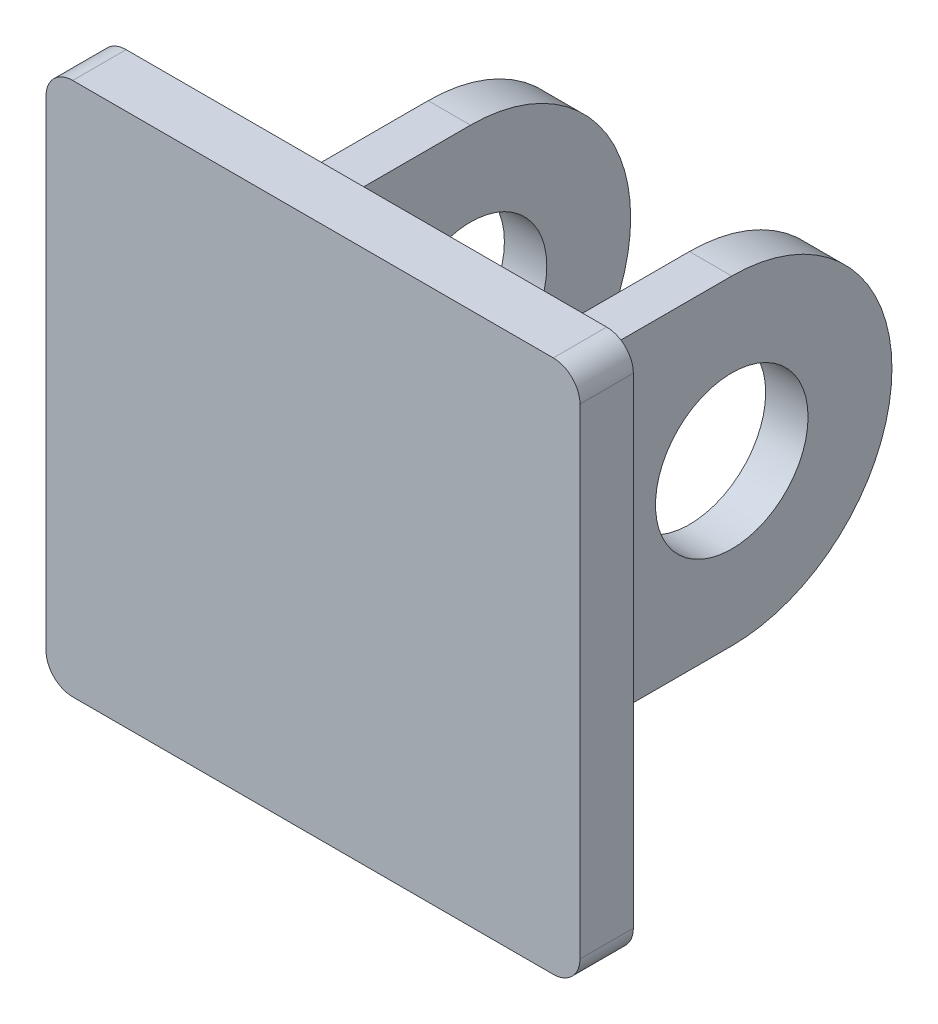
ISO-10303-21;
HEADER;
FILE_DESCRIPTION(('STEP AP214'),'2;1');
FILE_NAME('part.step','',(''),(''),'','','');
FILE_SCHEMA(('AUTOMOTIVE_DESIGN { 1 0 10303 214 1 1 1 1 }'));
ENDSEC;
DATA;
#1=APPLICATION_CONTEXT('core data for automotive mechanical design processes');
#2=APPLICATION_PROTOCOL_DEFINITION('international standard','automotive_design',2000,#1);
#3=PRODUCT_CONTEXT('',#1,'mechanical');
#4=PRODUCT('Part','Part','',(#3));
#5=PRODUCT_RELATED_PRODUCT_CATEGORY('part','',(#4));
#6=PRODUCT_DEFINITION_FORMATION('','',#4);
#7=PRODUCT_DEFINITION_CONTEXT('part definition',#1,'design');
#8=PRODUCT_DEFINITION('design','',#6,#7);
#9=PRODUCT_DEFINITION_SHAPE('','',#8);
#10=(LENGTH_UNIT() NAMED_UNIT(*) SI_UNIT(.MILLI.,.METRE.));
#11=(NAMED_UNIT(*) PLANE_ANGLE_UNIT() SI_UNIT($,.RADIAN.));
#12=(NAMED_UNIT(*) SI_UNIT($,.STERADIAN.) SOLID_ANGLE_UNIT());
#13=UNCERTAINTY_MEASURE_WITH_UNIT(LENGTH_MEASURE(1.E-05),#10,'distance_accuracy_value','');
#14=(GEOMETRIC_REPRESENTATION_CONTEXT(3) GLOBAL_UNCERTAINTY_ASSIGNED_CONTEXT((#13)) GLOBAL_UNIT_ASSIGNED_CONTEXT((#10,
#11,#12)) REPRESENTATION_CONTEXT('',''));
#15=CARTESIAN_POINT('',(0.,0.,0.));
#16=DIRECTION('',(0.,0.,1.));
#17=DIRECTION('',(1.,0.,0.));
#18=AXIS2_PLACEMENT_3D('',#15,#16,#17);
#19=CARTESIAN_POINT('',(0.,0.,0.));
#20=DIRECTION('',(0.,0.,-1.));
#21=DIRECTION('',(-1.,0.,0.));
#22=AXIS2_PLACEMENT_3D('',#19,#20,#21);
#23=PLANE('',#22);
#24=DIRECTION('',(1.,0.,0.));
#25=VECTOR('',#24,1.);
#26=CARTESIAN_POINT('',(50.,-50.,0.));
#27=LINE('',#26,#25);
#28=CARTESIAN_POINT('',(-45.,-50.,0.));
#29=VERTEX_POINT('',#28);
#30=CARTESIAN_POINT('',(45.,-50.,0.));
#31=VERTEX_POINT('',#30);
#32=EDGE_CURVE('E249',#29,#31,#27,.T.);
#33=ORIENTED_EDGE('',*,*,#32,.F.);
#34=CARTESIAN_POINT('',(-45.,-45.,0.));
#35=DIRECTION('',(0.,0.,-1.));
#36=DIRECTION('',(-1.,0.,0.));
#37=AXIS2_PLACEMENT_3D('',#34,#35,#36);
#38=CIRCLE('',#37,5.);
#39=CARTESIAN_POINT('',(-50.,-45.,0.));
#40=VERTEX_POINT('',#39);
#41=EDGE_CURVE('E266',#29,#40,#38,.T.);
#42=ORIENTED_EDGE('',*,*,#41,.T.);
#43=DIRECTION('',(0.,-1.,0.));
#44=VECTOR('',#43,1.);
#45=CARTESIAN_POINT('',(-50.,50.,0.));
#46=LINE('',#45,#44);
#47=CARTESIAN_POINT('',(-50.,45.,0.));
#48=VERTEX_POINT('',#47);
#49=EDGE_CURVE('E234',#48,#40,#46,.T.);
#50=ORIENTED_EDGE('',*,*,#49,.F.);
#51=CARTESIAN_POINT('',(-45.,45.,0.));
#52=DIRECTION('',(0.,0.,-1.));
#53=DIRECTION('',(-1.,0.,0.));
#54=AXIS2_PLACEMENT_3D('',#51,#52,#53);
#55=CIRCLE('',#54,5.);
#56=CARTESIAN_POINT('',(-45.,50.,0.));
#57=VERTEX_POINT('',#56);
#58=EDGE_CURVE('E264',#48,#57,#55,.T.);
#59=ORIENTED_EDGE('',*,*,#58,.T.);
#60=DIRECTION('',(-1.,0.,0.));
#61=VECTOR('',#60,1.);
#62=CARTESIAN_POINT('',(50.,50.,0.));
#63=LINE('',#62,#61);
#64=CARTESIAN_POINT('',(45.,50.,0.));
#65=VERTEX_POINT('',#64);
#66=EDGE_CURVE('E239',#65,#57,#63,.T.);
#67=ORIENTED_EDGE('',*,*,#66,.F.);
#68=CARTESIAN_POINT('',(45.,45.,0.));
#69=DIRECTION('',(0.,0.,-1.));
#70=DIRECTION('',(-1.,0.,0.));
#71=AXIS2_PLACEMENT_3D('',#68,#69,#70);
#72=CIRCLE('',#71,5.);
#73=CARTESIAN_POINT('',(50.,45.,0.));
#74=VERTEX_POINT('',#73);
#75=EDGE_CURVE('E260',#65,#74,#72,.T.);
#76=ORIENTED_EDGE('',*,*,#75,.T.);
#77=DIRECTION('',(0.,1.,0.));
#78=VECTOR('',#77,1.);
#79=CARTESIAN_POINT('',(50.,50.,0.));
#80=LINE('',#79,#78);
#81=CARTESIAN_POINT('',(50.,-45.,0.));
#82=VERTEX_POINT('',#81);
#83=EDGE_CURVE('E252',#82,#74,#80,.T.);
#84=ORIENTED_EDGE('',*,*,#83,.F.);
#85=CARTESIAN_POINT('',(45.,-45.,0.));
#86=DIRECTION('',(0.,0.,-1.));
#87=DIRECTION('',(-1.,0.,0.));
#88=AXIS2_PLACEMENT_3D('',#85,#86,#87);
#89=CIRCLE('',#88,5.);
#90=EDGE_CURVE('E262',#82,#31,#89,.T.);
#91=ORIENTED_EDGE('',*,*,#90,.T.);
#92=EDGE_LOOP('',(#33,#42,#50,#59,#67,#76,#84,#91));
#93=FACE_BOUND('',#92,.T.);
#94=DIRECTION('',(0.,-1.,0.));
#95=VECTOR('',#94,1.);
#96=CARTESIAN_POINT('',(20.5,30.,0.));
#97=LINE('',#96,#95);
#98=CARTESIAN_POINT('',(20.5,30.,0.));
#99=VERTEX_POINT('',#98);
#100=CARTESIAN_POINT('',(20.5,-30.,0.));
#101=VERTEX_POINT('',#100);
#102=EDGE_CURVE('E201',#99,#101,#97,.T.);
#103=ORIENTED_EDGE('',*,*,#102,.T.);
#104=DIRECTION('',(-1.,0.,0.));
#105=VECTOR('',#104,1.);
#106=CARTESIAN_POINT('',(28.4375,-30.,0.));
#107=LINE('',#106,#105);
#108=CARTESIAN_POINT('',(28.4375,-30.,0.));
#109=VERTEX_POINT('',#108);
#110=EDGE_CURVE('E231',#109,#101,#107,.T.);
#111=ORIENTED_EDGE('',*,*,#110,.F.);
#112=DIRECTION('',(0.,-1.,0.));
#113=VECTOR('',#112,1.);
#114=CARTESIAN_POINT('',(28.4375,30.,0.));
#115=LINE('',#114,#113);
#116=CARTESIAN_POINT('',(28.4375,30.,0.));
#117=VERTEX_POINT('',#116);
#118=EDGE_CURVE('E204',#117,#109,#115,.T.);
#119=ORIENTED_EDGE('',*,*,#118,.F.);
#120=DIRECTION('',(-1.,0.,0.));
#121=VECTOR('',#120,1.);
#122=CARTESIAN_POINT('',(28.4375,30.,0.));
#123=LINE('',#122,#121);
#124=EDGE_CURVE('E214',#117,#99,#123,.T.);
#125=ORIENTED_EDGE('',*,*,#124,.T.);
#126=EDGE_LOOP('',(#103,#111,#119,#125));
#127=FACE_BOUND('',#126,.T.);
#128=DIRECTION('',(1.,0.,0.));
#129=VECTOR('',#128,1.);
#130=CARTESIAN_POINT('',(-28.4375,30.,0.));
#131=LINE('',#130,#129);
#132=CARTESIAN_POINT('',(-28.4375,30.,0.));
#133=VERTEX_POINT('',#132);
#134=CARTESIAN_POINT('',(-20.5,30.,0.));
#135=VERTEX_POINT('',#134);
#136=EDGE_CURVE('E165',#133,#135,#131,.T.);
#137=ORIENTED_EDGE('',*,*,#136,.F.);
#138=DIRECTION('',(0.,-1.,0.));
#139=VECTOR('',#138,1.);
#140=CARTESIAN_POINT('',(-28.4375,30.,0.));
#141=LINE('',#140,#139);
#142=CARTESIAN_POINT('',(-28.4375,-30.,0.));
#143=VERTEX_POINT('',#142);
#144=EDGE_CURVE('E175',#133,#143,#141,.T.);
#145=ORIENTED_EDGE('',*,*,#144,.T.);
#146=DIRECTION('',(1.,0.,0.));
#147=VECTOR('',#146,1.);
#148=CARTESIAN_POINT('',(-28.4375,-30.,0.));
#149=LINE('',#148,#147);
#150=CARTESIAN_POINT('',(-20.5,-30.,0.));
#151=VERTEX_POINT('',#150);
#152=EDGE_CURVE('E180',#143,#151,#149,.T.);
#153=ORIENTED_EDGE('',*,*,#152,.T.);
#154=DIRECTION('',(0.,-1.,0.));
#155=VECTOR('',#154,1.);
#156=CARTESIAN_POINT('',(-20.5,30.,0.));
#157=LINE('',#156,#155);
#158=EDGE_CURVE('E184',#135,#151,#157,.T.);
#159=ORIENTED_EDGE('',*,*,#158,.F.);
#160=EDGE_LOOP('',(#137,#145,#153,#159));
#161=FACE_BOUND('',#160,.T.);
#162=ADVANCED_FACE('F39',(#93,#127,#161),#23,.T.);
#163=CARTESIAN_POINT('',(-50.,50.,10.));
#164=DIRECTION('',(1.,0.,0.));
#165=DIRECTION('',(0.,1.,0.));
#166=AXIS2_PLACEMENT_3D('',#163,#164,#165);
#167=PLANE('',#166);
#168=ORIENTED_EDGE('',*,*,#49,.T.);
#169=DIRECTION('',(0.,0.,-1.));
#170=VECTOR('',#169,1.);
#171=CARTESIAN_POINT('',(-50.,-45.,10.));
#172=LINE('',#171,#170);
#173=CARTESIAN_POINT('',(-50.,-45.,10.));
#174=VERTEX_POINT('',#173);
#175=EDGE_CURVE('E271',#40,#174,#172,.F.);
#176=ORIENTED_EDGE('',*,*,#175,.T.);
#177=DIRECTION('',(0.,-1.,0.));
#178=VECTOR('',#177,1.);
#179=CARTESIAN_POINT('',(-50.,50.,10.));
#180=LINE('',#179,#178);
#181=CARTESIAN_POINT('',(-50.,45.,10.));
#182=VERTEX_POINT('',#181);
#183=EDGE_CURVE('E235',#182,#174,#180,.T.);
#184=ORIENTED_EDGE('',*,*,#183,.F.);
#185=DIRECTION('',(0.,0.,-1.));
#186=VECTOR('',#185,1.);
#187=CARTESIAN_POINT('',(-50.,45.,10.));
#188=LINE('',#187,#186);
#189=EDGE_CURVE('E268',#182,#48,#188,.T.);
#190=ORIENTED_EDGE('',*,*,#189,.T.);
#191=EDGE_LOOP('',(#168,#176,#184,#190));
#192=FACE_BOUND('',#191,.T.);
#193=ADVANCED_FACE('F305',(#192),#167,.F.);
#194=CARTESIAN_POINT('',(50.,-50.,10.));
#195=DIRECTION('',(0.,1.,0.));
#196=DIRECTION('',(-1.,0.,0.));
#197=AXIS2_PLACEMENT_3D('',#194,#195,#196);
#198=PLANE('',#197);
#199=DIRECTION('',(1.,0.,0.));
#200=VECTOR('',#199,1.);
#201=CARTESIAN_POINT('',(50.,-50.,10.));
#202=LINE('',#201,#200);
#203=CARTESIAN_POINT('',(-45.,-50.,10.));
#204=VERTEX_POINT('',#203);
#205=CARTESIAN_POINT('',(45.,-50.,10.));
#206=VERTEX_POINT('',#205);
#207=EDGE_CURVE('E238',#204,#206,#202,.T.);
#208=ORIENTED_EDGE('',*,*,#207,.F.);
#209=DIRECTION('',(0.,0.,-1.));
#210=VECTOR('',#209,1.);
#211=CARTESIAN_POINT('',(-45.,-50.,10.));
#212=LINE('',#211,#210);
#213=EDGE_CURVE('E257',#204,#29,#212,.T.);
#214=ORIENTED_EDGE('',*,*,#213,.T.);
#215=ORIENTED_EDGE('',*,*,#32,.T.);
#216=DIRECTION('',(0.,0.,-1.));
#217=VECTOR('',#216,1.);
#218=CARTESIAN_POINT('',(45.,-50.,10.));
#219=LINE('',#218,#217);
#220=EDGE_CURVE('E246',#31,#206,#219,.F.);
#221=ORIENTED_EDGE('',*,*,#220,.T.);
#222=EDGE_LOOP('',(#208,#214,#215,#221));
#223=FACE_BOUND('',#222,.T.);
#224=ADVANCED_FACE('F313',(#223),#198,.F.);
#225=CARTESIAN_POINT('',(50.,50.,10.));
#226=DIRECTION('',(-1.,0.,0.));
#227=DIRECTION('',(0.,-1.,0.));
#228=AXIS2_PLACEMENT_3D('',#225,#226,#227);
#229=PLANE('',#228);
#230=DIRECTION('',(0.,1.,0.));
#231=VECTOR('',#230,1.);
#232=CARTESIAN_POINT('',(50.,50.,10.));
#233=LINE('',#232,#231);
#234=CARTESIAN_POINT('',(50.,-45.,10.));
#235=VERTEX_POINT('',#234);
#236=CARTESIAN_POINT('',(50.,45.,10.));
#237=VERTEX_POINT('',#236);
#238=EDGE_CURVE('E242',#235,#237,#233,.T.);
#239=ORIENTED_EDGE('',*,*,#238,.F.);
#240=DIRECTION('',(0.,0.,-1.));
#241=VECTOR('',#240,1.);
#242=CARTESIAN_POINT('',(50.,-45.,10.));
#243=LINE('',#242,#241);
#244=EDGE_CURVE('E11',#235,#82,#243,.T.);
#245=ORIENTED_EDGE('',*,*,#244,.T.);
#246=ORIENTED_EDGE('',*,*,#83,.T.);
#247=DIRECTION('',(0.,0.,-1.));
#248=VECTOR('',#247,1.);
#249=CARTESIAN_POINT('',(50.,45.,10.));
#250=LINE('',#249,#248);
#251=EDGE_CURVE('E47',#74,#237,#250,.F.);
#252=ORIENTED_EDGE('',*,*,#251,.T.);
#253=EDGE_LOOP('',(#239,#245,#246,#252));
#254=FACE_BOUND('',#253,.T.);
#255=ADVANCED_FACE('F286',(#254),#229,.F.);
#256=CARTESIAN_POINT('',(50.,50.,10.));
#257=DIRECTION('',(0.,-1.,0.));
#258=DIRECTION('',(1.,0.,0.));
#259=AXIS2_PLACEMENT_3D('',#256,#257,#258);
#260=PLANE('',#259);
#261=ORIENTED_EDGE('',*,*,#66,.T.);
#262=DIRECTION('',(0.,0.,-1.));
#263=VECTOR('',#262,1.);
#264=CARTESIAN_POINT('',(-45.,50.,10.));
#265=LINE('',#264,#263);
#266=CARTESIAN_POINT('',(-45.,50.,10.));
#267=VERTEX_POINT('',#266);
#268=EDGE_CURVE('E54',#57,#267,#265,.F.);
#269=ORIENTED_EDGE('',*,*,#268,.T.);
#270=DIRECTION('',(-1.,0.,0.));
#271=VECTOR('',#270,1.);
#272=CARTESIAN_POINT('',(50.,50.,10.));
#273=LINE('',#272,#271);
#274=CARTESIAN_POINT('',(45.,50.,10.));
#275=VERTEX_POINT('',#274);
#276=EDGE_CURVE('E244',#275,#267,#273,.T.);
#277=ORIENTED_EDGE('',*,*,#276,.F.);
#278=DIRECTION('',(0.,0.,-1.));
#279=VECTOR('',#278,1.);
#280=CARTESIAN_POINT('',(45.,50.,10.));
#281=LINE('',#280,#279);
#282=EDGE_CURVE('E280',#275,#65,#281,.T.);
#283=ORIENTED_EDGE('',*,*,#282,.T.);
#284=EDGE_LOOP('',(#261,#269,#277,#283));
#285=FACE_BOUND('',#284,.T.);
#286=ADVANCED_FACE('F294',(#285),#260,.F.);
#287=CARTESIAN_POINT('',(0.,0.,10.));
#288=DIRECTION('',(0.,0.,-1.));
#289=DIRECTION('',(-1.,0.,0.));
#290=AXIS2_PLACEMENT_3D('',#287,#288,#289);
#291=PLANE('',#290);
#292=ORIENTED_EDGE('',*,*,#183,.T.);
#293=CARTESIAN_POINT('',(-45.,-45.,10.));
#294=DIRECTION('',(0.,0.,-1.));
#295=DIRECTION('',(-1.,0.,0.));
#296=AXIS2_PLACEMENT_3D('',#293,#294,#295);
#297=CIRCLE('',#296,5.);
#298=EDGE_CURVE('E278',#174,#204,#297,.F.);
#299=ORIENTED_EDGE('',*,*,#298,.T.);
#300=ORIENTED_EDGE('',*,*,#207,.T.);
#301=CARTESIAN_POINT('',(45.,-45.,10.));
#302=DIRECTION('',(0.,0.,-1.));
#303=DIRECTION('',(-1.,0.,0.));
#304=AXIS2_PLACEMENT_3D('',#301,#302,#303);
#305=CIRCLE('',#304,5.);
#306=EDGE_CURVE('E274',#206,#235,#305,.F.);
#307=ORIENTED_EDGE('',*,*,#306,.T.);
#308=ORIENTED_EDGE('',*,*,#238,.T.);
#309=CARTESIAN_POINT('',(45.,45.,10.));
#310=DIRECTION('',(0.,0.,-1.));
#311=DIRECTION('',(-1.,0.,0.));
#312=AXIS2_PLACEMENT_3D('',#309,#310,#311);
#313=CIRCLE('',#312,5.);
#314=EDGE_CURVE('E61',#237,#275,#313,.F.);
#315=ORIENTED_EDGE('',*,*,#314,.T.);
#316=ORIENTED_EDGE('',*,*,#276,.T.);
#317=CARTESIAN_POINT('',(-45.,45.,10.));
#318=DIRECTION('',(0.,0.,-1.));
#319=DIRECTION('',(-1.,0.,0.));
#320=AXIS2_PLACEMENT_3D('',#317,#318,#319);
#321=CIRCLE('',#320,5.);
#322=EDGE_CURVE('E276',#267,#182,#321,.F.);
#323=ORIENTED_EDGE('',*,*,#322,.T.);
#324=EDGE_LOOP('',(#292,#299,#300,#307,#308,#315,#316,#323));
#325=FACE_BOUND('',#324,.T.);
#326=ADVANCED_FACE('F290',(#325),#291,.F.);
#327=CARTESIAN_POINT('',(28.4375,0.,-40.));
#328=DIRECTION('',(-1.,0.,0.));
#329=DIRECTION('',(0.,0.,1.));
#330=AXIS2_PLACEMENT_3D('',#327,#328,#329);
#331=PLANE('',#330);
#332=ORIENTED_EDGE('',*,*,#118,.T.);
#333=DIRECTION('',(0.,0.,-1.));
#334=VECTOR('',#333,1.);
#335=CARTESIAN_POINT('',(28.4375,-30.,0.));
#336=LINE('',#335,#334);
#337=CARTESIAN_POINT('',(28.4375,-30.,-40.));
#338=VERTEX_POINT('',#337);
#339=EDGE_CURVE('E207',#109,#338,#336,.T.);
#340=ORIENTED_EDGE('',*,*,#339,.T.);
#341=CARTESIAN_POINT('',(28.4375,0.,-40.));
#342=DIRECTION('',(1.,0.,0.));
#343=DIRECTION('',(0.,0.,1.));
#344=AXIS2_PLACEMENT_3D('',#341,#342,#343);
#345=CIRCLE('',#344,30.);
#346=CARTESIAN_POINT('',(28.4375,30.,-40.));
#347=VERTEX_POINT('',#346);
#348=EDGE_CURVE('E210',#338,#347,#345,.T.);
#349=ORIENTED_EDGE('',*,*,#348,.T.);
#350=DIRECTION('',(0.,0.,1.));
#351=VECTOR('',#350,1.);
#352=CARTESIAN_POINT('',(28.4375,30.,0.));
#353=LINE('',#352,#351);
#354=EDGE_CURVE('E212',#347,#117,#353,.T.);
#355=ORIENTED_EDGE('',*,*,#354,.T.);
#356=EDGE_LOOP('',(#332,#340,#349,#355));
#357=FACE_BOUND('',#356,.T.);
#358=CARTESIAN_POINT('',(28.4375,0.,-40.));
#359=DIRECTION('',(1.,0.,0.));
#360=DIRECTION('',(0.,0.,-1.));
#361=AXIS2_PLACEMENT_3D('',#358,#359,#360);
#362=CIRCLE('',#361,14.2875);
#363=CARTESIAN_POINT('',(28.4375,0.,-54.2875));
#364=VERTEX_POINT('',#363);
#365=EDGE_CURVE('E198',#364,#364,#362,.T.);
#366=ORIENTED_EDGE('',*,*,#365,.F.);
#367=EDGE_LOOP('',(#366));
#368=FACE_BOUND('',#367,.T.);
#369=ADVANCED_FACE('F370',(#357,#368),#331,.F.);
#370=CARTESIAN_POINT('',(20.5,0.,-40.));
#371=DIRECTION('',(-1.,0.,0.));
#372=DIRECTION('',(0.,0.,1.));
#373=AXIS2_PLACEMENT_3D('',#370,#371,#372);
#374=PLANE('',#373);
#375=ORIENTED_EDGE('',*,*,#102,.F.);
#376=DIRECTION('',(0.,0.,1.));
#377=VECTOR('',#376,1.);
#378=CARTESIAN_POINT('',(20.5,30.,0.));
#379=LINE('',#378,#377);
#380=CARTESIAN_POINT('',(20.5,30.,-40.));
#381=VERTEX_POINT('',#380);
#382=EDGE_CURVE('E208',#381,#99,#379,.T.);
#383=ORIENTED_EDGE('',*,*,#382,.F.);
#384=CARTESIAN_POINT('',(20.5,0.,-40.));
#385=DIRECTION('',(1.,0.,0.));
#386=DIRECTION('',(0.,0.,1.));
#387=AXIS2_PLACEMENT_3D('',#384,#385,#386);
#388=CIRCLE('',#387,30.);
#389=CARTESIAN_POINT('',(20.5,-30.,-40.));
#390=VERTEX_POINT('',#389);
#391=EDGE_CURVE('E219',#390,#381,#388,.T.);
#392=ORIENTED_EDGE('',*,*,#391,.F.);
#393=DIRECTION('',(0.,0.,-1.));
#394=VECTOR('',#393,1.);
#395=CARTESIAN_POINT('',(20.5,-30.,0.));
#396=LINE('',#395,#394);
#397=EDGE_CURVE('E217',#101,#390,#396,.T.);
#398=ORIENTED_EDGE('',*,*,#397,.F.);
#399=EDGE_LOOP('',(#375,#383,#392,#398));
#400=FACE_BOUND('',#399,.T.);
#401=CARTESIAN_POINT('',(20.5,0.,-40.));
#402=DIRECTION('',(1.,0.,0.));
#403=DIRECTION('',(0.,0.,-1.));
#404=AXIS2_PLACEMENT_3D('',#401,#402,#403);
#405=CIRCLE('',#404,14.2875);
#406=CARTESIAN_POINT('',(20.5,0.,-54.2875));
#407=VERTEX_POINT('',#406);
#408=EDGE_CURVE('E197',#407,#407,#405,.T.);
#409=ORIENTED_EDGE('',*,*,#408,.T.);
#410=EDGE_LOOP('',(#409));
#411=FACE_BOUND('',#410,.T.);
#412=ADVANCED_FACE('F373',(#400,#411),#374,.T.);
#413=CARTESIAN_POINT('',(28.4375,-30.,0.));
#414=DIRECTION('',(0.,1.,0.));
#415=DIRECTION('',(0.,0.,1.));
#416=AXIS2_PLACEMENT_3D('',#413,#414,#415);
#417=PLANE('',#416);
#418=ORIENTED_EDGE('',*,*,#397,.T.);
#419=DIRECTION('',(-1.,0.,0.));
#420=VECTOR('',#419,1.);
#421=CARTESIAN_POINT('',(28.4375,-30.,-40.));
#422=LINE('',#421,#420);
#423=EDGE_CURVE('E228',#338,#390,#422,.T.);
#424=ORIENTED_EDGE('',*,*,#423,.F.);
#425=ORIENTED_EDGE('',*,*,#339,.F.);
#426=ORIENTED_EDGE('',*,*,#110,.T.);
#427=EDGE_LOOP('',(#418,#424,#425,#426));
#428=FACE_BOUND('',#427,.T.);
#429=ADVANCED_FACE('F377',(#428),#417,.F.);
#430=CARTESIAN_POINT('',(28.4375,0.,-40.));
#431=DIRECTION('',(-1.,0.,0.));
#432=DIRECTION('',(0.,0.,1.));
#433=AXIS2_PLACEMENT_3D('',#430,#431,#432);
#434=CYLINDRICAL_SURFACE('',#433,30.);
#435=ORIENTED_EDGE('',*,*,#391,.T.);
#436=DIRECTION('',(-1.,0.,0.));
#437=VECTOR('',#436,1.);
#438=CARTESIAN_POINT('',(28.4375,30.,-40.));
#439=LINE('',#438,#437);
#440=EDGE_CURVE('E225',#347,#381,#439,.T.);
#441=ORIENTED_EDGE('',*,*,#440,.F.);
#442=ORIENTED_EDGE('',*,*,#348,.F.);
#443=ORIENTED_EDGE('',*,*,#423,.T.);
#444=EDGE_LOOP('',(#435,#441,#442,#443));
#445=FACE_BOUND('',#444,.T.);
#446=ADVANCED_FACE('F381',(#445),#434,.T.);
#447=CARTESIAN_POINT('',(28.4375,30.,0.));
#448=DIRECTION('',(0.,-1.,0.));
#449=DIRECTION('',(0.,0.,-1.));
#450=AXIS2_PLACEMENT_3D('',#447,#448,#449);
#451=PLANE('',#450);
#452=ORIENTED_EDGE('',*,*,#382,.T.);
#453=ORIENTED_EDGE('',*,*,#124,.F.);
#454=ORIENTED_EDGE('',*,*,#354,.F.);
#455=ORIENTED_EDGE('',*,*,#440,.T.);
#456=EDGE_LOOP('',(#452,#453,#454,#455));
#457=FACE_BOUND('',#456,.T.);
#458=ADVANCED_FACE('F368',(#457),#451,.F.);
#459=CARTESIAN_POINT('',(28.4375,0.,-40.));
#460=DIRECTION('',(-1.,0.,0.));
#461=DIRECTION('',(0.,0.,1.));
#462=AXIS2_PLACEMENT_3D('',#459,#460,#461);
#463=CYLINDRICAL_SURFACE('',#462,14.2875);
#464=ORIENTED_EDGE('',*,*,#365,.T.);
#465=EDGE_LOOP('',(#464));
#466=FACE_BOUND('',#465,.T.);
#467=ORIENTED_EDGE('',*,*,#408,.F.);
#468=EDGE_LOOP('',(#467));
#469=FACE_BOUND('',#468,.T.);
#470=ADVANCED_FACE('F365',(#466,#469),#463,.F.);
#471=CARTESIAN_POINT('',(-28.4375,30.,0.));
#472=DIRECTION('',(0.,1.,0.));
#473=DIRECTION('',(0.,0.,1.));
#474=AXIS2_PLACEMENT_3D('',#471,#472,#473);
#475=PLANE('',#474);
#476=DIRECTION('',(0.,0.,1.));
#477=VECTOR('',#476,1.);
#478=CARTESIAN_POINT('',(-20.5,30.,0.));
#479=LINE('',#478,#477);
#480=CARTESIAN_POINT('',(-20.5,30.,-40.));
#481=VERTEX_POINT('',#480);
#482=EDGE_CURVE('E160',#481,#135,#479,.T.);
#483=ORIENTED_EDGE('',*,*,#482,.F.);
#484=DIRECTION('',(1.,0.,0.));
#485=VECTOR('',#484,1.);
#486=CARTESIAN_POINT('',(-28.4375,30.,-40.));
#487=LINE('',#486,#485);
#488=CARTESIAN_POINT('',(-28.4375,30.,-40.));
#489=VERTEX_POINT('',#488);
#490=EDGE_CURVE('E154',#489,#481,#487,.T.);
#491=ORIENTED_EDGE('',*,*,#490,.F.);
#492=DIRECTION('',(0.,0.,1.));
#493=VECTOR('',#492,1.);
#494=CARTESIAN_POINT('',(-28.4375,30.,0.));
#495=LINE('',#494,#493);
#496=EDGE_CURVE('E158',#489,#133,#495,.T.);
#497=ORIENTED_EDGE('',*,*,#496,.T.);
#498=ORIENTED_EDGE('',*,*,#136,.T.);
#499=EDGE_LOOP('',(#483,#491,#497,#498));
#500=FACE_BOUND('',#499,.T.);
#501=ADVANCED_FACE('F156',(#500),#475,.T.);
#502=CARTESIAN_POINT('',(-28.4375,0.,-40.));
#503=DIRECTION('',(1.,0.,0.));
#504=DIRECTION('',(0.,0.,-1.));
#505=AXIS2_PLACEMENT_3D('',#502,#503,#504);
#506=CYLINDRICAL_SURFACE('',#505,30.);
#507=CARTESIAN_POINT('',(-20.5,0.,-40.));
#508=DIRECTION('',(1.,0.,0.));
#509=DIRECTION('',(0.,0.,1.));
#510=AXIS2_PLACEMENT_3D('',#507,#508,#509);
#511=CIRCLE('',#510,30.);
#512=CARTESIAN_POINT('',(-20.5,-30.,-40.));
#513=VERTEX_POINT('',#512);
#514=EDGE_CURVE('E189',#513,#481,#511,.T.);
#515=ORIENTED_EDGE('',*,*,#514,.F.);
#516=DIRECTION('',(1.,0.,0.));
#517=VECTOR('',#516,1.);
#518=CARTESIAN_POINT('',(-28.4375,-30.,-40.));
#519=LINE('',#518,#517);
#520=CARTESIAN_POINT('',(-28.4375,-30.,-40.));
#521=VERTEX_POINT('',#520);
#522=EDGE_CURVE('E166',#521,#513,#519,.T.);
#523=ORIENTED_EDGE('',*,*,#522,.F.);
#524=CARTESIAN_POINT('',(-28.4375,0.,-40.));
#525=DIRECTION('',(1.,0.,0.));
#526=DIRECTION('',(0.,0.,1.));
#527=AXIS2_PLACEMENT_3D('',#524,#525,#526);
#528=CIRCLE('',#527,30.);
#529=EDGE_CURVE('E173',#521,#489,#528,.T.);
#530=ORIENTED_EDGE('',*,*,#529,.T.);
#531=ORIENTED_EDGE('',*,*,#490,.T.);
#532=EDGE_LOOP('',(#515,#523,#530,#531));
#533=FACE_BOUND('',#532,.T.);
#534=ADVANCED_FACE('F177',(#533),#506,.T.);
#535=CARTESIAN_POINT('',(-28.4375,-30.,0.));
#536=DIRECTION('',(0.,-1.,0.));
#537=DIRECTION('',(0.,0.,-1.));
#538=AXIS2_PLACEMENT_3D('',#535,#536,#537);
#539=PLANE('',#538);
#540=DIRECTION('',(0.,0.,-1.));
#541=VECTOR('',#540,1.);
#542=CARTESIAN_POINT('',(-20.5,-30.,0.));
#543=LINE('',#542,#541);
#544=EDGE_CURVE('E191',#151,#513,#543,.T.);
#545=ORIENTED_EDGE('',*,*,#544,.F.);
#546=ORIENTED_EDGE('',*,*,#152,.F.);
#547=DIRECTION('',(0.,0.,-1.));
#548=VECTOR('',#547,1.);
#549=CARTESIAN_POINT('',(-28.4375,-30.,0.));
#550=LINE('',#549,#548);
#551=EDGE_CURVE('E178',#143,#521,#550,.T.);
#552=ORIENTED_EDGE('',*,*,#551,.T.);
#553=ORIENTED_EDGE('',*,*,#522,.T.);
#554=EDGE_LOOP('',(#545,#546,#552,#553));
#555=FACE_BOUND('',#554,.T.);
#556=ADVANCED_FACE('F355',(#555),#539,.T.);
#557=CARTESIAN_POINT('',(-28.4375,0.,-40.));
#558=DIRECTION('',(1.,0.,0.));
#559=DIRECTION('',(0.,0.,1.));
#560=AXIS2_PLACEMENT_3D('',#557,#558,#559);
#561=PLANE('',#560);
#562=CARTESIAN_POINT('',(-28.4375,0.,-40.));
#563=DIRECTION('',(1.,0.,0.));
#564=DIRECTION('',(0.,0.,-1.));
#565=AXIS2_PLACEMENT_3D('',#562,#563,#564);
#566=CIRCLE('',#565,14.2875);
#567=CARTESIAN_POINT('',(-28.4375,0.,-54.2875));
#568=VERTEX_POINT('',#567);
#569=EDGE_CURVE('E187',#568,#568,#566,.T.);
#570=ORIENTED_EDGE('',*,*,#569,.T.);
#571=EDGE_LOOP('',(#570));
#572=FACE_BOUND('',#571,.T.);
#573=ORIENTED_EDGE('',*,*,#144,.F.);
#574=ORIENTED_EDGE('',*,*,#496,.F.);
#575=ORIENTED_EDGE('',*,*,#529,.F.);
#576=ORIENTED_EDGE('',*,*,#551,.F.);
#577=EDGE_LOOP('',(#573,#574,#575,#576));
#578=FACE_BOUND('',#577,.T.);
#579=ADVANCED_FACE('F171',(#572,#578),#561,.F.);
#580=CARTESIAN_POINT('',(-20.5,0.,-40.));
#581=DIRECTION('',(1.,0.,0.));
#582=DIRECTION('',(0.,0.,1.));
#583=AXIS2_PLACEMENT_3D('',#580,#581,#582);
#584=PLANE('',#583);
#585=CARTESIAN_POINT('',(-20.5,0.,-40.));
#586=DIRECTION('',(1.,0.,0.));
#587=DIRECTION('',(0.,0.,-1.));
#588=AXIS2_PLACEMENT_3D('',#585,#586,#587);
#589=CIRCLE('',#588,14.2875);
#590=CARTESIAN_POINT('',(-20.5,0.,-54.2875));
#591=VERTEX_POINT('',#590);
#592=EDGE_CURVE('E408',#591,#591,#589,.T.);
#593=ORIENTED_EDGE('',*,*,#592,.F.);
#594=EDGE_LOOP('',(#593));
#595=FACE_BOUND('',#594,.T.);
#596=ORIENTED_EDGE('',*,*,#158,.T.);
#597=ORIENTED_EDGE('',*,*,#544,.T.);
#598=ORIENTED_EDGE('',*,*,#514,.T.);
#599=ORIENTED_EDGE('',*,*,#482,.T.);
#600=EDGE_LOOP('',(#596,#597,#598,#599));
#601=FACE_BOUND('',#600,.T.);
#602=ADVANCED_FACE('F343',(#595,#601),#584,.T.);
#603=CARTESIAN_POINT('',(-28.4375,0.,-40.));
#604=DIRECTION('',(1.,0.,0.));
#605=DIRECTION('',(0.,0.,-1.));
#606=AXIS2_PLACEMENT_3D('',#603,#604,#605);
#607=CYLINDRICAL_SURFACE('',#606,14.2875);
#608=ORIENTED_EDGE('',*,*,#569,.F.);
#609=EDGE_LOOP('',(#608));
#610=FACE_BOUND('',#609,.T.);
#611=ORIENTED_EDGE('',*,*,#592,.T.);
#612=EDGE_LOOP('',(#611));
#613=FACE_BOUND('',#612,.T.);
#614=ADVANCED_FACE('F339',(#610,#613),#607,.F.);
#615=CARTESIAN_POINT('',(-45.,-45.,10.));
#616=DIRECTION('',(0.,0.,-1.));
#617=DIRECTION('',(-1.,0.,0.));
#618=AXIS2_PLACEMENT_3D('',#615,#616,#617);
#619=CYLINDRICAL_SURFACE('',#618,5.);
#620=ORIENTED_EDGE('',*,*,#298,.F.);
#621=ORIENTED_EDGE('',*,*,#175,.F.);
#622=ORIENTED_EDGE('',*,*,#41,.F.);
#623=ORIENTED_EDGE('',*,*,#213,.F.);
#624=EDGE_LOOP('',(#620,#621,#622,#623));
#625=FACE_BOUND('',#624,.T.);
#626=ADVANCED_FACE('F311',(#625),#619,.T.);
#627=CARTESIAN_POINT('',(-45.,45.,10.));
#628=DIRECTION('',(0.,0.,-1.));
#629=DIRECTION('',(-1.,0.,0.));
#630=AXIS2_PLACEMENT_3D('',#627,#628,#629);
#631=CYLINDRICAL_SURFACE('',#630,5.);
#632=ORIENTED_EDGE('',*,*,#322,.F.);
#633=ORIENTED_EDGE('',*,*,#268,.F.);
#634=ORIENTED_EDGE('',*,*,#58,.F.);
#635=ORIENTED_EDGE('',*,*,#189,.F.);
#636=EDGE_LOOP('',(#632,#633,#634,#635));
#637=FACE_BOUND('',#636,.T.);
#638=ADVANCED_FACE('F302',(#637),#631,.T.);
#639=CARTESIAN_POINT('',(45.,-45.,10.));
#640=DIRECTION('',(0.,0.,-1.));
#641=DIRECTION('',(-1.,0.,0.));
#642=AXIS2_PLACEMENT_3D('',#639,#640,#641);
#643=CYLINDRICAL_SURFACE('',#642,5.);
#644=ORIENTED_EDGE('',*,*,#306,.F.);
#645=ORIENTED_EDGE('',*,*,#220,.F.);
#646=ORIENTED_EDGE('',*,*,#90,.F.);
#647=ORIENTED_EDGE('',*,*,#244,.F.);
#648=EDGE_LOOP('',(#644,#645,#646,#647));
#649=FACE_BOUND('',#648,.T.);
#650=ADVANCED_FACE('F316',(#649),#643,.T.);
#651=CARTESIAN_POINT('',(45.,45.,10.));
#652=DIRECTION('',(0.,0.,-1.));
#653=DIRECTION('',(-1.,0.,0.));
#654=AXIS2_PLACEMENT_3D('',#651,#652,#653);
#655=CYLINDRICAL_SURFACE('',#654,5.);
#656=ORIENTED_EDGE('',*,*,#314,.F.);
#657=ORIENTED_EDGE('',*,*,#251,.F.);
#658=ORIENTED_EDGE('',*,*,#75,.F.);
#659=ORIENTED_EDGE('',*,*,#282,.F.);
#660=EDGE_LOOP('',(#656,#657,#658,#659));
#661=FACE_BOUND('',#660,.T.);
#662=ADVANCED_FACE('F41',(#661),#655,.T.);
#663=CLOSED_SHELL('',(#162,#193,#224,#255,#286,#326,#369,#412,#429,#446,#458,#470,#501,#534,
#556,#579,#602,#614,#626,#638,#650,#662));
#664=MANIFOLD_SOLID_BREP('B2',#663);
#665=ADVANCED_BREP_SHAPE_REPRESENTATION('',(#18,#664),#14);
#666=SHAPE_DEFINITION_REPRESENTATION(#9,#665);
ENDSEC;
END-ISO-10303-21;
